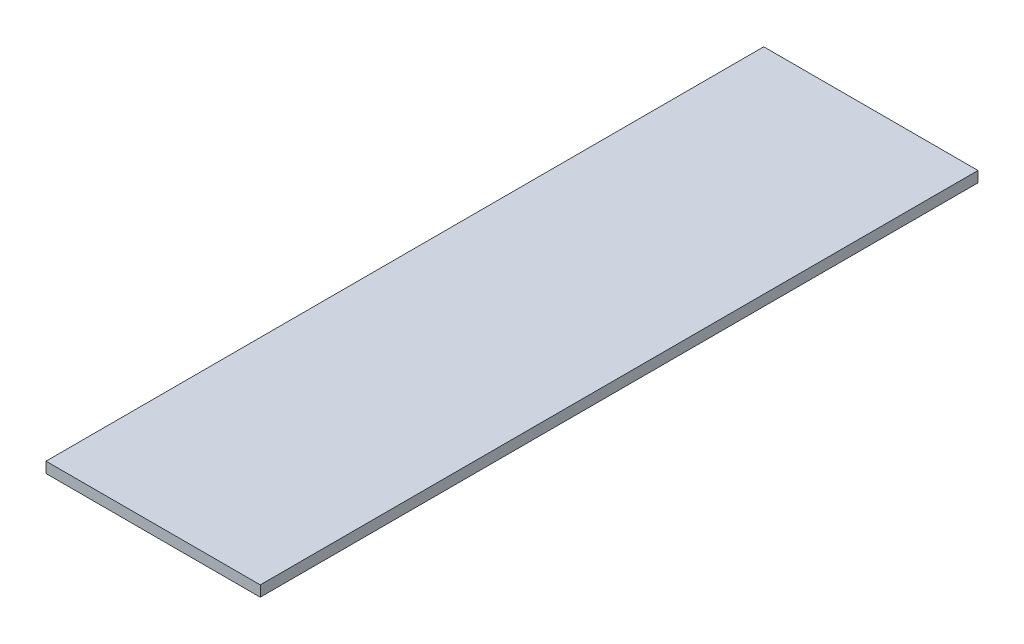
ISO-10303-21;
HEADER;
FILE_DESCRIPTION(('STEP AP214'),'2;1');
FILE_NAME('part.step','',(''),(''),'','','');
FILE_SCHEMA(('AUTOMOTIVE_DESIGN { 1 0 10303 214 1 1 1 1 }'));
ENDSEC;
DATA;
#1=APPLICATION_CONTEXT('core data for automotive mechanical design processes');
#2=APPLICATION_PROTOCOL_DEFINITION('international standard','automotive_design',2000,#1);
#3=PRODUCT_CONTEXT('',#1,'mechanical');
#4=PRODUCT('Part','Part','',(#3));
#5=PRODUCT_RELATED_PRODUCT_CATEGORY('part','',(#4));
#6=PRODUCT_DEFINITION_FORMATION('','',#4);
#7=PRODUCT_DEFINITION_CONTEXT('part definition',#1,'design');
#8=PRODUCT_DEFINITION('design','',#6,#7);
#9=PRODUCT_DEFINITION_SHAPE('','',#8);
#10=(LENGTH_UNIT() NAMED_UNIT(*) SI_UNIT(.MILLI.,.METRE.));
#11=(NAMED_UNIT(*) PLANE_ANGLE_UNIT() SI_UNIT($,.RADIAN.));
#12=(NAMED_UNIT(*) SI_UNIT($,.STERADIAN.) SOLID_ANGLE_UNIT());
#13=UNCERTAINTY_MEASURE_WITH_UNIT(LENGTH_MEASURE(1.E-05),#10,'distance_accuracy_value','');
#14=(GEOMETRIC_REPRESENTATION_CONTEXT(3) GLOBAL_UNCERTAINTY_ASSIGNED_CONTEXT((#13)) GLOBAL_UNIT_ASSIGNED_CONTEXT((#10,
#11,#12)) REPRESENTATION_CONTEXT('',''));
#15=CARTESIAN_POINT('',(0.,0.,0.));
#16=DIRECTION('',(0.,0.,1.));
#17=DIRECTION('',(1.,0.,0.));
#18=AXIS2_PLACEMENT_3D('',#15,#16,#17);
#19=CARTESIAN_POINT('',(0.,3.175,0.));
#20=DIRECTION('',(1.,0.,0.));
#21=DIRECTION('',(0.,0.,-1.));
#22=AXIS2_PLACEMENT_3D('',#19,#20,#21);
#23=PLANE('',#22);
#24=DIRECTION('',(0.,0.,1.));
#25=VECTOR('',#24,1.);
#26=CARTESIAN_POINT('',(0.,0.,0.));
#27=LINE('',#26,#25);
#28=CARTESIAN_POINT('',(0.,0.,-212.725));
#29=VERTEX_POINT('',#28);
#30=CARTESIAN_POINT('',(0.,0.,0.));
#31=VERTEX_POINT('',#30);
#32=EDGE_CURVE('E107',#29,#31,#27,.T.);
#33=ORIENTED_EDGE('',*,*,#32,.T.);
#34=DIRECTION('',(0.,-1.,0.));
#35=VECTOR('',#34,1.);
#36=CARTESIAN_POINT('',(0.,3.175,0.));
#37=LINE('',#36,#35);
#38=CARTESIAN_POINT('',(0.,3.175,0.));
#39=VERTEX_POINT('',#38);
#40=EDGE_CURVE('E11',#39,#31,#37,.T.);
#41=ORIENTED_EDGE('',*,*,#40,.F.);
#42=DIRECTION('',(0.,0.,1.));
#43=VECTOR('',#42,1.);
#44=CARTESIAN_POINT('',(0.,3.175,0.));
#45=LINE('',#44,#43);
#46=CARTESIAN_POINT('',(0.,3.175,-212.725));
#47=VERTEX_POINT('',#46);
#48=EDGE_CURVE('E91',#47,#39,#45,.T.);
#49=ORIENTED_EDGE('',*,*,#48,.F.);
#50=DIRECTION('',(0.,-1.,0.));
#51=VECTOR('',#50,1.);
#52=CARTESIAN_POINT('',(0.,3.175,-212.725));
#53=LINE('',#52,#51);
#54=EDGE_CURVE('E103',#47,#29,#53,.T.);
#55=ORIENTED_EDGE('',*,*,#54,.T.);
#56=EDGE_LOOP('',(#33,#41,#49,#55));
#57=FACE_BOUND('',#56,.T.);
#58=ADVANCED_FACE('F39',(#57),#23,.F.);
#59=CARTESIAN_POINT('',(0.,3.175,0.));
#60=DIRECTION('',(0.,0.,-1.));
#61=DIRECTION('',(-1.,0.,0.));
#62=AXIS2_PLACEMENT_3D('',#59,#60,#61);
#63=PLANE('',#62);
#64=DIRECTION('',(1.,0.,0.));
#65=VECTOR('',#64,1.);
#66=CARTESIAN_POINT('',(0.,0.,0.));
#67=LINE('',#66,#65);
#68=CARTESIAN_POINT('',(63.5,0.,0.));
#69=VERTEX_POINT('',#68);
#70=EDGE_CURVE('E96',#31,#69,#67,.T.);
#71=ORIENTED_EDGE('',*,*,#70,.T.);
#72=DIRECTION('',(0.,-1.,0.));
#73=VECTOR('',#72,1.);
#74=CARTESIAN_POINT('',(63.5,3.175,0.));
#75=LINE('',#74,#73);
#76=CARTESIAN_POINT('',(63.5,3.175,0.));
#77=VERTEX_POINT('',#76);
#78=EDGE_CURVE('E48',#77,#69,#75,.T.);
#79=ORIENTED_EDGE('',*,*,#78,.F.);
#80=DIRECTION('',(1.,0.,0.));
#81=VECTOR('',#80,1.);
#82=CARTESIAN_POINT('',(0.,3.175,0.));
#83=LINE('',#82,#81);
#84=EDGE_CURVE('E86',#39,#77,#83,.T.);
#85=ORIENTED_EDGE('',*,*,#84,.F.);
#86=ORIENTED_EDGE('',*,*,#40,.T.);
#87=EDGE_LOOP('',(#71,#79,#85,#86));
#88=FACE_BOUND('',#87,.T.);
#89=ADVANCED_FACE('F95',(#88),#63,.F.);
#90=CARTESIAN_POINT('',(63.5,3.175,0.));
#91=DIRECTION('',(-1.,0.,0.));
#92=DIRECTION('',(0.,0.,1.));
#93=AXIS2_PLACEMENT_3D('',#90,#91,#92);
#94=PLANE('',#93);
#95=DIRECTION('',(0.,0.,-1.));
#96=VECTOR('',#95,1.);
#97=CARTESIAN_POINT('',(63.5,0.,0.));
#98=LINE('',#97,#96);
#99=CARTESIAN_POINT('',(63.5,0.,-212.725));
#100=VERTEX_POINT('',#99);
#101=EDGE_CURVE('E73',#69,#100,#98,.T.);
#102=ORIENTED_EDGE('',*,*,#101,.T.);
#103=DIRECTION('',(0.,-1.,0.));
#104=VECTOR('',#103,1.);
#105=CARTESIAN_POINT('',(63.5,3.175,-212.725));
#106=LINE('',#105,#104);
#107=CARTESIAN_POINT('',(63.5,3.175,-212.725));
#108=VERTEX_POINT('',#107);
#109=EDGE_CURVE('E98',#108,#100,#106,.T.);
#110=ORIENTED_EDGE('',*,*,#109,.F.);
#111=DIRECTION('',(0.,0.,-1.));
#112=VECTOR('',#111,1.);
#113=CARTESIAN_POINT('',(63.5,3.175,0.));
#114=LINE('',#113,#112);
#115=EDGE_CURVE('E89',#77,#108,#114,.T.);
#116=ORIENTED_EDGE('',*,*,#115,.F.);
#117=ORIENTED_EDGE('',*,*,#78,.T.);
#118=EDGE_LOOP('',(#102,#110,#116,#117));
#119=FACE_BOUND('',#118,.T.);
#120=ADVANCED_FACE('F99',(#119),#94,.F.);
#121=CARTESIAN_POINT('',(0.,3.175,-212.725));
#122=DIRECTION('',(0.,0.,1.));
#123=DIRECTION('',(1.,0.,0.));
#124=AXIS2_PLACEMENT_3D('',#121,#122,#123);
#125=PLANE('',#124);
#126=DIRECTION('',(-1.,0.,0.));
#127=VECTOR('',#126,1.);
#128=CARTESIAN_POINT('',(0.,0.,-212.725));
#129=LINE('',#128,#127);
#130=EDGE_CURVE('E79',#100,#29,#129,.T.);
#131=ORIENTED_EDGE('',*,*,#130,.T.);
#132=ORIENTED_EDGE('',*,*,#54,.F.);
#133=DIRECTION('',(-1.,0.,0.));
#134=VECTOR('',#133,1.);
#135=CARTESIAN_POINT('',(0.,3.175,-212.725));
#136=LINE('',#135,#134);
#137=EDGE_CURVE('E56',#108,#47,#136,.T.);
#138=ORIENTED_EDGE('',*,*,#137,.F.);
#139=ORIENTED_EDGE('',*,*,#109,.T.);
#140=EDGE_LOOP('',(#131,#132,#138,#139));
#141=FACE_BOUND('',#140,.T.);
#142=ADVANCED_FACE('F120',(#141),#125,.F.);
#143=CARTESIAN_POINT('',(0.,3.175,0.));
#144=DIRECTION('',(0.,-1.,0.));
#145=DIRECTION('',(0.,0.,-1.));
#146=AXIS2_PLACEMENT_3D('',#143,#144,#145);
#147=PLANE('',#146);
#148=ORIENTED_EDGE('',*,*,#48,.T.);
#149=ORIENTED_EDGE('',*,*,#84,.T.);
#150=ORIENTED_EDGE('',*,*,#115,.T.);
#151=ORIENTED_EDGE('',*,*,#137,.T.);
#152=EDGE_LOOP('',(#148,#149,#150,#151));
#153=FACE_BOUND('',#152,.T.);
#154=ADVANCED_FACE('F87',(#153),#147,.F.);
#155=CARTESIAN_POINT('',(0.,0.,0.));
#156=DIRECTION('',(0.,-1.,0.));
#157=DIRECTION('',(0.,0.,-1.));
#158=AXIS2_PLACEMENT_3D('',#155,#156,#157);
#159=PLANE('',#158);
#160=ORIENTED_EDGE('',*,*,#32,.F.);
#161=ORIENTED_EDGE('',*,*,#130,.F.);
#162=ORIENTED_EDGE('',*,*,#101,.F.);
#163=ORIENTED_EDGE('',*,*,#70,.F.);
#164=EDGE_LOOP('',(#160,#161,#162,#163));
#165=FACE_BOUND('',#164,.T.);
#166=ADVANCED_FACE('F123',(#165),#159,.T.);
#167=CLOSED_SHELL('',(#58,#89,#120,#142,#154,#166));
#168=MANIFOLD_SOLID_BREP('B2',#167);
#169=ADVANCED_BREP_SHAPE_REPRESENTATION('',(#18,#168),#14);
#170=SHAPE_DEFINITION_REPRESENTATION(#9,#169);
ENDSEC;
END-ISO-10303-21;
